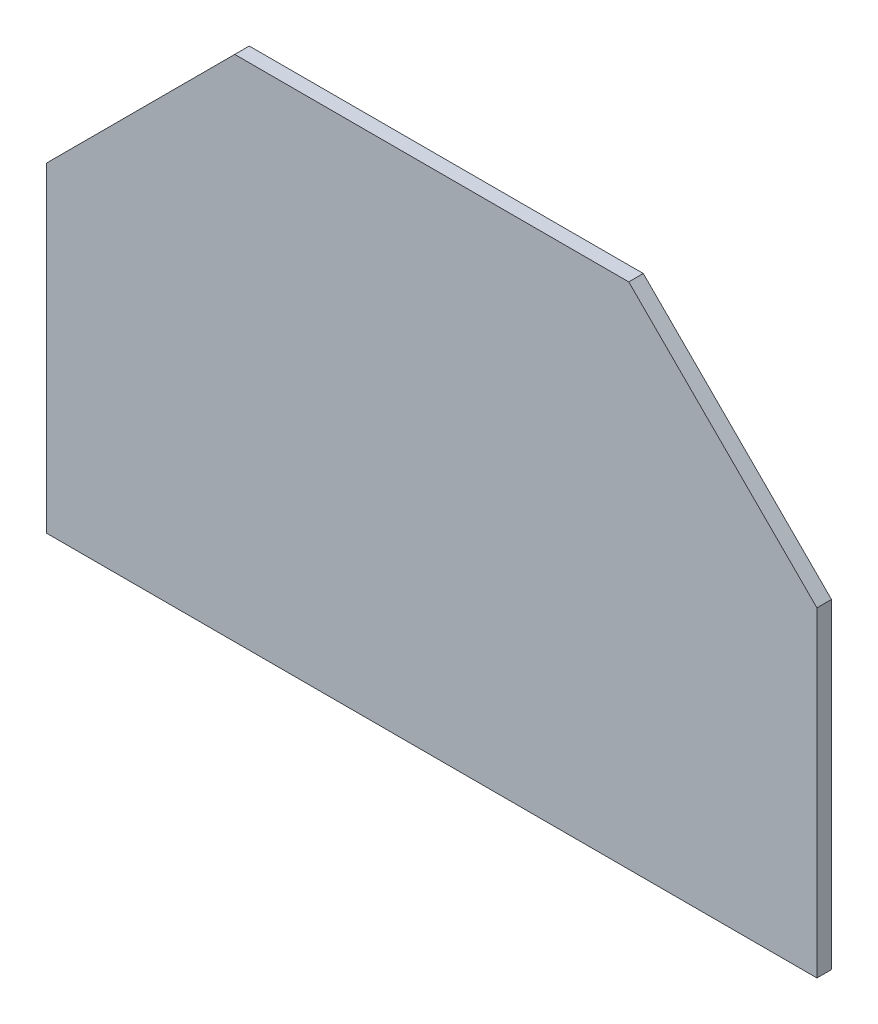
ISO-10303-21;
HEADER;
FILE_DESCRIPTION(('STEP AP214'),'2;1');
FILE_NAME('part.step','',(''),(''),'','','');
FILE_SCHEMA(('AUTOMOTIVE_DESIGN { 1 0 10303 214 1 1 1 1 }'));
ENDSEC;
DATA;
#1=APPLICATION_CONTEXT('core data for automotive mechanical design processes');
#2=APPLICATION_PROTOCOL_DEFINITION('international standard','automotive_design',2000,#1);
#3=PRODUCT_CONTEXT('',#1,'mechanical');
#4=PRODUCT('Part','Part','',(#3));
#5=PRODUCT_RELATED_PRODUCT_CATEGORY('part','',(#4));
#6=PRODUCT_DEFINITION_FORMATION('','',#4);
#7=PRODUCT_DEFINITION_CONTEXT('part definition',#1,'design');
#8=PRODUCT_DEFINITION('design','',#6,#7);
#9=PRODUCT_DEFINITION_SHAPE('','',#8);
#10=(LENGTH_UNIT() NAMED_UNIT(*) SI_UNIT(.MILLI.,.METRE.));
#11=(NAMED_UNIT(*) PLANE_ANGLE_UNIT() SI_UNIT($,.RADIAN.));
#12=(NAMED_UNIT(*) SI_UNIT($,.STERADIAN.) SOLID_ANGLE_UNIT());
#13=UNCERTAINTY_MEASURE_WITH_UNIT(LENGTH_MEASURE(1.E-05),#10,'distance_accuracy_value','');
#14=(GEOMETRIC_REPRESENTATION_CONTEXT(3) GLOBAL_UNCERTAINTY_ASSIGNED_CONTEXT((#13)) GLOBAL_UNIT_ASSIGNED_CONTEXT((#10,
#11,#12)) REPRESENTATION_CONTEXT('',''));
#15=CARTESIAN_POINT('',(0.,0.,0.));
#16=DIRECTION('',(0.,0.,1.));
#17=DIRECTION('',(1.,0.,0.));
#18=AXIS2_PLACEMENT_3D('',#15,#16,#17);
#19=CARTESIAN_POINT('',(-134.62,23.1335766823975,5.08));
#20=DIRECTION('',(1.,0.,0.));
#21=DIRECTION('',(0.,0.,-1.));
#22=AXIS2_PLACEMENT_3D('',#19,#20,#21);
#23=PLANE('',#22);
#24=DIRECTION('',(0.,-1.,0.));
#25=VECTOR('',#24,1.);
#26=CARTESIAN_POINT('',(-134.62,23.1335766823975,0.));
#27=LINE('',#26,#25);
#28=CARTESIAN_POINT('',(-134.62,23.1335766823975,0.));
#29=VERTEX_POINT('',#28);
#30=CARTESIAN_POINT('',(-134.62,-88.9,0.));
#31=VERTEX_POINT('',#30);
#32=EDGE_CURVE('E119',#29,#31,#27,.T.);
#33=ORIENTED_EDGE('',*,*,#32,.T.);
#34=DIRECTION('',(0.,0.,-1.));
#35=VECTOR('',#34,1.);
#36=CARTESIAN_POINT('',(-134.62,-88.9,5.08));
#37=LINE('',#36,#35);
#38=CARTESIAN_POINT('',(-134.62,-88.9,5.08));
#39=VERTEX_POINT('',#38);
#40=EDGE_CURVE('E11',#39,#31,#37,.T.);
#41=ORIENTED_EDGE('',*,*,#40,.F.);
#42=DIRECTION('',(0.,-1.,0.));
#43=VECTOR('',#42,1.);
#44=CARTESIAN_POINT('',(-134.62,23.1335766823975,5.08));
#45=LINE('',#44,#43);
#46=CARTESIAN_POINT('',(-134.62,23.1335766823975,5.08));
#47=VERTEX_POINT('',#46);
#48=EDGE_CURVE('E129',#47,#39,#45,.T.);
#49=ORIENTED_EDGE('',*,*,#48,.F.);
#50=DIRECTION('',(0.,0.,-1.));
#51=VECTOR('',#50,1.);
#52=CARTESIAN_POINT('',(-134.62,23.1335766823975,5.08));
#53=LINE('',#52,#51);
#54=EDGE_CURVE('E115',#47,#29,#53,.T.);
#55=ORIENTED_EDGE('',*,*,#54,.T.);
#56=EDGE_LOOP('',(#33,#41,#49,#55));
#57=FACE_BOUND('',#56,.T.);
#58=ADVANCED_FACE('F35',(#57),#23,.F.);
#59=CARTESIAN_POINT('',(-134.62,-88.9,5.08));
#60=DIRECTION('',(0.,1.,0.));
#61=DIRECTION('',(0.,0.,1.));
#62=AXIS2_PLACEMENT_3D('',#59,#60,#61);
#63=PLANE('',#62);
#64=DIRECTION('',(1.,0.,0.));
#65=VECTOR('',#64,1.);
#66=CARTESIAN_POINT('',(-134.62,-88.9,0.));
#67=LINE('',#66,#65);
#68=CARTESIAN_POINT('',(134.62,-88.9,0.));
#69=VERTEX_POINT('',#68);
#70=EDGE_CURVE('E122',#31,#69,#67,.T.);
#71=ORIENTED_EDGE('',*,*,#70,.T.);
#72=DIRECTION('',(0.,0.,-1.));
#73=VECTOR('',#72,1.);
#74=CARTESIAN_POINT('',(134.62,-88.9,5.08));
#75=LINE('',#74,#73);
#76=CARTESIAN_POINT('',(134.62,-88.9,5.08));
#77=VERTEX_POINT('',#76);
#78=EDGE_CURVE('E43',#77,#69,#75,.T.);
#79=ORIENTED_EDGE('',*,*,#78,.F.);
#80=DIRECTION('',(1.,0.,0.));
#81=VECTOR('',#80,1.);
#82=CARTESIAN_POINT('',(-134.62,-88.9,5.08));
#83=LINE('',#82,#81);
#84=EDGE_CURVE('E88',#39,#77,#83,.T.);
#85=ORIENTED_EDGE('',*,*,#84,.F.);
#86=ORIENTED_EDGE('',*,*,#40,.T.);
#87=EDGE_LOOP('',(#71,#79,#85,#86));
#88=FACE_BOUND('',#87,.T.);
#89=ADVANCED_FACE('F153',(#88),#63,.F.);
#90=CARTESIAN_POINT('',(134.62,23.1335766823974,5.08));
#91=DIRECTION('',(-1.,0.,0.));
#92=DIRECTION('',(0.,0.,1.));
#93=AXIS2_PLACEMENT_3D('',#90,#91,#92);
#94=PLANE('',#93);
#95=DIRECTION('',(0.,1.,0.));
#96=VECTOR('',#95,1.);
#97=CARTESIAN_POINT('',(134.62,23.1335766823974,0.));
#98=LINE('',#97,#96);
#99=CARTESIAN_POINT('',(134.62,23.1335766823974,0.));
#100=VERTEX_POINT('',#99);
#101=EDGE_CURVE('E124',#69,#100,#98,.T.);
#102=ORIENTED_EDGE('',*,*,#101,.T.);
#103=DIRECTION('',(0.,0.,-1.));
#104=VECTOR('',#103,1.);
#105=CARTESIAN_POINT('',(134.62,23.1335766823974,5.08));
#106=LINE('',#105,#104);
#107=CARTESIAN_POINT('',(134.62,23.1335766823974,5.08));
#108=VERTEX_POINT('',#107);
#109=EDGE_CURVE('E110',#108,#100,#106,.T.);
#110=ORIENTED_EDGE('',*,*,#109,.F.);
#111=DIRECTION('',(0.,1.,0.));
#112=VECTOR('',#111,1.);
#113=CARTESIAN_POINT('',(134.62,23.1335766823974,5.08));
#114=LINE('',#113,#112);
#115=EDGE_CURVE('E101',#77,#108,#114,.T.);
#116=ORIENTED_EDGE('',*,*,#115,.F.);
#117=ORIENTED_EDGE('',*,*,#78,.T.);
#118=EDGE_LOOP('',(#102,#110,#116,#117));
#119=FACE_BOUND('',#118,.T.);
#120=ADVANCED_FACE('F135',(#119),#94,.F.);
#121=CARTESIAN_POINT('',(134.62,23.1335766823974,5.08));
#122=DIRECTION('',(-0.707106781186546,-0.707106781186549,0.));
#123=DIRECTION('',(0.707106781186549,-0.707106781186546,0.));
#124=AXIS2_PLACEMENT_3D('',#121,#122,#123);
#125=PLANE('',#124);
#126=DIRECTION('',(-0.707106781186549,0.707106781186546,0.));
#127=VECTOR('',#126,1.);
#128=CARTESIAN_POINT('',(134.62,23.1335766823974,0.));
#129=LINE('',#128,#127);
#130=CARTESIAN_POINT('',(68.8535766823972,88.9,0.));
#131=VERTEX_POINT('',#130);
#132=EDGE_CURVE('E109',#100,#131,#129,.T.);
#133=ORIENTED_EDGE('',*,*,#132,.T.);
#134=DIRECTION('',(0.,0.,-1.));
#135=VECTOR('',#134,1.);
#136=CARTESIAN_POINT('',(68.8535766823972,88.9,5.08));
#137=LINE('',#136,#135);
#138=CARTESIAN_POINT('',(68.8535766823972,88.9,5.08));
#139=VERTEX_POINT('',#138);
#140=EDGE_CURVE('E106',#139,#131,#137,.T.);
#141=ORIENTED_EDGE('',*,*,#140,.F.);
#142=DIRECTION('',(-0.707106781186549,0.707106781186546,0.));
#143=VECTOR('',#142,1.);
#144=CARTESIAN_POINT('',(134.62,23.1335766823974,5.08));
#145=LINE('',#144,#143);
#146=EDGE_CURVE('E95',#108,#139,#145,.T.);
#147=ORIENTED_EDGE('',*,*,#146,.F.);
#148=ORIENTED_EDGE('',*,*,#109,.T.);
#149=EDGE_LOOP('',(#133,#141,#147,#148));
#150=FACE_BOUND('',#149,.T.);
#151=ADVANCED_FACE('F107',(#150),#125,.F.);
#152=CARTESIAN_POINT('',(68.8535766823972,88.9,5.08));
#153=DIRECTION('',(0.,-1.,0.));
#154=DIRECTION('',(0.,0.,-1.));
#155=AXIS2_PLACEMENT_3D('',#152,#153,#154);
#156=PLANE('',#155);
#157=DIRECTION('',(-1.,0.,0.));
#158=VECTOR('',#157,1.);
#159=CARTESIAN_POINT('',(68.8535766823972,88.9,0.));
#160=LINE('',#159,#158);
#161=CARTESIAN_POINT('',(-68.8535766823981,88.9,0.));
#162=VERTEX_POINT('',#161);
#163=EDGE_CURVE('E74',#131,#162,#160,.T.);
#164=ORIENTED_EDGE('',*,*,#163,.T.);
#165=DIRECTION('',(0.,0.,-1.));
#166=VECTOR('',#165,1.);
#167=CARTESIAN_POINT('',(-68.8535766823981,88.9,5.08));
#168=LINE('',#167,#166);
#169=CARTESIAN_POINT('',(-68.8535766823981,88.9,5.08));
#170=VERTEX_POINT('',#169);
#171=EDGE_CURVE('E111',#170,#162,#168,.T.);
#172=ORIENTED_EDGE('',*,*,#171,.F.);
#173=DIRECTION('',(-1.,0.,0.));
#174=VECTOR('',#173,1.);
#175=CARTESIAN_POINT('',(68.8535766823972,88.9,5.08));
#176=LINE('',#175,#174);
#177=EDGE_CURVE('E99',#139,#170,#176,.T.);
#178=ORIENTED_EDGE('',*,*,#177,.F.);
#179=ORIENTED_EDGE('',*,*,#140,.T.);
#180=EDGE_LOOP('',(#164,#172,#178,#179));
#181=FACE_BOUND('',#180,.T.);
#182=ADVANCED_FACE('F113',(#181),#156,.F.);
#183=CARTESIAN_POINT('',(-68.8535766823981,88.9,5.08));
#184=DIRECTION('',(0.707106781186551,-0.707106781186544,0.));
#185=DIRECTION('',(0.707106781186544,0.707106781186551,0.));
#186=AXIS2_PLACEMENT_3D('',#183,#184,#185);
#187=PLANE('',#186);
#188=DIRECTION('',(-0.707106781186544,-0.707106781186551,0.));
#189=VECTOR('',#188,1.);
#190=CARTESIAN_POINT('',(-68.8535766823981,88.9,0.));
#191=LINE('',#190,#189);
#192=EDGE_CURVE('E80',#162,#29,#191,.T.);
#193=ORIENTED_EDGE('',*,*,#192,.T.);
#194=ORIENTED_EDGE('',*,*,#54,.F.);
#195=DIRECTION('',(-0.707106781186544,-0.707106781186551,0.));
#196=VECTOR('',#195,1.);
#197=CARTESIAN_POINT('',(-68.8535766823981,88.9,5.08));
#198=LINE('',#197,#196);
#199=EDGE_CURVE('E51',#170,#47,#198,.T.);
#200=ORIENTED_EDGE('',*,*,#199,.F.);
#201=ORIENTED_EDGE('',*,*,#171,.T.);
#202=EDGE_LOOP('',(#193,#194,#200,#201));
#203=FACE_BOUND('',#202,.T.);
#204=ADVANCED_FACE('F142',(#203),#187,.F.);
#205=CARTESIAN_POINT('',(0.,0.,5.08));
#206=DIRECTION('',(0.,0.,1.));
#207=DIRECTION('',(1.,0.,0.));
#208=AXIS2_PLACEMENT_3D('',#205,#206,#207);
#209=PLANE('',#208);
#210=ORIENTED_EDGE('',*,*,#48,.T.);
#211=ORIENTED_EDGE('',*,*,#84,.T.);
#212=ORIENTED_EDGE('',*,*,#115,.T.);
#213=ORIENTED_EDGE('',*,*,#146,.T.);
#214=ORIENTED_EDGE('',*,*,#177,.T.);
#215=ORIENTED_EDGE('',*,*,#199,.T.);
#216=EDGE_LOOP('',(#210,#211,#212,#213,#214,#215));
#217=FACE_BOUND('',#216,.T.);
#218=ADVANCED_FACE('F97',(#217),#209,.T.);
#219=CARTESIAN_POINT('',(0.,0.,0.));
#220=DIRECTION('',(0.,0.,1.));
#221=DIRECTION('',(1.,0.,0.));
#222=AXIS2_PLACEMENT_3D('',#219,#220,#221);
#223=PLANE('',#222);
#224=ORIENTED_EDGE('',*,*,#32,.F.);
#225=ORIENTED_EDGE('',*,*,#192,.F.);
#226=ORIENTED_EDGE('',*,*,#163,.F.);
#227=ORIENTED_EDGE('',*,*,#132,.F.);
#228=ORIENTED_EDGE('',*,*,#101,.F.);
#229=ORIENTED_EDGE('',*,*,#70,.F.);
#230=EDGE_LOOP('',(#224,#225,#226,#227,#228,#229));
#231=FACE_BOUND('',#230,.T.);
#232=ADVANCED_FACE('F138',(#231),#223,.F.);
#233=CLOSED_SHELL('',(#58,#89,#120,#151,#182,#204,#218,#232));
#234=MANIFOLD_SOLID_BREP('B2',#233);
#235=ADVANCED_BREP_SHAPE_REPRESENTATION('',(#18,#234),#14);
#236=SHAPE_DEFINITION_REPRESENTATION(#9,#235);
ENDSEC;
END-ISO-10303-21;
